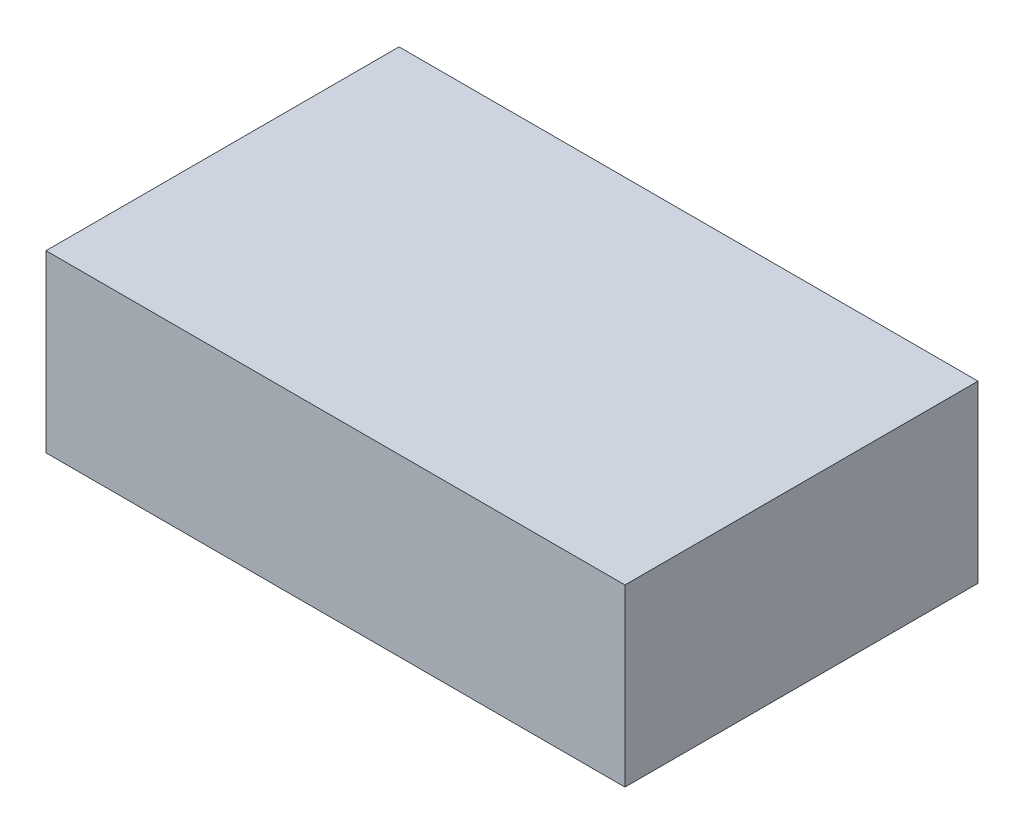
ISO-10303-21;
HEADER;
FILE_DESCRIPTION(('STEP AP214'),'2;1');
FILE_NAME('part.step','',(''),(''),'','','');
FILE_SCHEMA(('AUTOMOTIVE_DESIGN { 1 0 10303 214 1 1 1 1 }'));
ENDSEC;
DATA;
#1=APPLICATION_CONTEXT('core data for automotive mechanical design processes');
#2=APPLICATION_PROTOCOL_DEFINITION('international standard','automotive_design',2000,#1);
#3=PRODUCT_CONTEXT('',#1,'mechanical');
#4=PRODUCT('Part','Part','',(#3));
#5=PRODUCT_RELATED_PRODUCT_CATEGORY('part','',(#4));
#6=PRODUCT_DEFINITION_FORMATION('','',#4);
#7=PRODUCT_DEFINITION_CONTEXT('part definition',#1,'design');
#8=PRODUCT_DEFINITION('design','',#6,#7);
#9=PRODUCT_DEFINITION_SHAPE('','',#8);
#10=(LENGTH_UNIT() NAMED_UNIT(*) SI_UNIT(.MILLI.,.METRE.));
#11=(NAMED_UNIT(*) PLANE_ANGLE_UNIT() SI_UNIT($,.RADIAN.));
#12=(NAMED_UNIT(*) SI_UNIT($,.STERADIAN.) SOLID_ANGLE_UNIT());
#13=UNCERTAINTY_MEASURE_WITH_UNIT(LENGTH_MEASURE(1.E-05),#10,'distance_accuracy_value','');
#14=(GEOMETRIC_REPRESENTATION_CONTEXT(3) GLOBAL_UNCERTAINTY_ASSIGNED_CONTEXT((#13)) GLOBAL_UNIT_ASSIGNED_CONTEXT((#10,
#11,#12)) REPRESENTATION_CONTEXT('',''));
#15=CARTESIAN_POINT('',(0.,0.,0.));
#16=DIRECTION('',(0.,0.,1.));
#17=DIRECTION('',(1.,0.,0.));
#18=AXIS2_PLACEMENT_3D('',#15,#16,#17);
#19=CARTESIAN_POINT('',(51.25,31.,-31.25));
#20=DIRECTION('',(-1.,0.,0.));
#21=DIRECTION('',(0.,0.,1.));
#22=AXIS2_PLACEMENT_3D('',#19,#20,#21);
#23=PLANE('',#22);
#24=DIRECTION('',(0.,0.,-1.));
#25=VECTOR('',#24,1.);
#26=CARTESIAN_POINT('',(51.25,0.,-31.25));
#27=LINE('',#26,#25);
#28=CARTESIAN_POINT('',(51.25,0.,31.25));
#29=VERTEX_POINT('',#28);
#30=CARTESIAN_POINT('',(51.25,0.,-31.25));
#31=VERTEX_POINT('',#30);
#32=EDGE_CURVE('E110',#29,#31,#27,.T.);
#33=ORIENTED_EDGE('',*,*,#32,.T.);
#34=DIRECTION('',(0.,-1.,0.));
#35=VECTOR('',#34,1.);
#36=CARTESIAN_POINT('',(51.25,31.,-31.25));
#37=LINE('',#36,#35);
#38=CARTESIAN_POINT('',(51.25,31.,-31.25));
#39=VERTEX_POINT('',#38);
#40=EDGE_CURVE('E11',#39,#31,#37,.T.);
#41=ORIENTED_EDGE('',*,*,#40,.F.);
#42=DIRECTION('',(0.,0.,-1.));
#43=VECTOR('',#42,1.);
#44=CARTESIAN_POINT('',(51.25,31.,-31.25));
#45=LINE('',#44,#43);
#46=CARTESIAN_POINT('',(51.25,31.,31.25));
#47=VERTEX_POINT('',#46);
#48=EDGE_CURVE('E94',#47,#39,#45,.T.);
#49=ORIENTED_EDGE('',*,*,#48,.F.);
#50=DIRECTION('',(0.,-1.,0.));
#51=VECTOR('',#50,1.);
#52=CARTESIAN_POINT('',(51.25,31.,31.25));
#53=LINE('',#52,#51);
#54=EDGE_CURVE('E106',#47,#29,#53,.T.);
#55=ORIENTED_EDGE('',*,*,#54,.T.);
#56=EDGE_LOOP('',(#33,#41,#49,#55));
#57=FACE_BOUND('',#56,.T.);
#58=ADVANCED_FACE('F42',(#57),#23,.F.);
#59=CARTESIAN_POINT('',(-51.25,31.,-31.25));
#60=DIRECTION('',(0.,0.,1.));
#61=DIRECTION('',(1.,0.,0.));
#62=AXIS2_PLACEMENT_3D('',#59,#60,#61);
#63=PLANE('',#62);
#64=DIRECTION('',(-1.,0.,0.));
#65=VECTOR('',#64,1.);
#66=CARTESIAN_POINT('',(-51.25,0.,-31.25));
#67=LINE('',#66,#65);
#68=CARTESIAN_POINT('',(-51.25,0.,-31.25));
#69=VERTEX_POINT('',#68);
#70=EDGE_CURVE('E99',#31,#69,#67,.T.);
#71=ORIENTED_EDGE('',*,*,#70,.T.);
#72=DIRECTION('',(0.,-1.,0.));
#73=VECTOR('',#72,1.);
#74=CARTESIAN_POINT('',(-51.25,31.,-31.25));
#75=LINE('',#74,#73);
#76=CARTESIAN_POINT('',(-51.25,31.,-31.25));
#77=VERTEX_POINT('',#76);
#78=EDGE_CURVE('E51',#77,#69,#75,.T.);
#79=ORIENTED_EDGE('',*,*,#78,.F.);
#80=DIRECTION('',(-1.,0.,0.));
#81=VECTOR('',#80,1.);
#82=CARTESIAN_POINT('',(-51.25,31.,-31.25));
#83=LINE('',#82,#81);
#84=EDGE_CURVE('E89',#39,#77,#83,.T.);
#85=ORIENTED_EDGE('',*,*,#84,.F.);
#86=ORIENTED_EDGE('',*,*,#40,.T.);
#87=EDGE_LOOP('',(#71,#79,#85,#86));
#88=FACE_BOUND('',#87,.T.);
#89=ADVANCED_FACE('F98',(#88),#63,.F.);
#90=CARTESIAN_POINT('',(-51.25,31.,-31.25));
#91=DIRECTION('',(1.,0.,0.));
#92=DIRECTION('',(0.,0.,-1.));
#93=AXIS2_PLACEMENT_3D('',#90,#91,#92);
#94=PLANE('',#93);
#95=DIRECTION('',(0.,0.,1.));
#96=VECTOR('',#95,1.);
#97=CARTESIAN_POINT('',(-51.25,0.,-31.25));
#98=LINE('',#97,#96);
#99=CARTESIAN_POINT('',(-51.25,0.,31.25));
#100=VERTEX_POINT('',#99);
#101=EDGE_CURVE('E76',#69,#100,#98,.T.);
#102=ORIENTED_EDGE('',*,*,#101,.T.);
#103=DIRECTION('',(0.,-1.,0.));
#104=VECTOR('',#103,1.);
#105=CARTESIAN_POINT('',(-51.25,31.,31.25));
#106=LINE('',#105,#104);
#107=CARTESIAN_POINT('',(-51.25,31.,31.25));
#108=VERTEX_POINT('',#107);
#109=EDGE_CURVE('E101',#108,#100,#106,.T.);
#110=ORIENTED_EDGE('',*,*,#109,.F.);
#111=DIRECTION('',(0.,0.,1.));
#112=VECTOR('',#111,1.);
#113=CARTESIAN_POINT('',(-51.25,31.,-31.25));
#114=LINE('',#113,#112);
#115=EDGE_CURVE('E92',#77,#108,#114,.T.);
#116=ORIENTED_EDGE('',*,*,#115,.F.);
#117=ORIENTED_EDGE('',*,*,#78,.T.);
#118=EDGE_LOOP('',(#102,#110,#116,#117));
#119=FACE_BOUND('',#118,.T.);
#120=ADVANCED_FACE('F102',(#119),#94,.F.);
#121=CARTESIAN_POINT('',(-51.25,31.,31.25));
#122=DIRECTION('',(0.,0.,-1.));
#123=DIRECTION('',(-1.,0.,0.));
#124=AXIS2_PLACEMENT_3D('',#121,#122,#123);
#125=PLANE('',#124);
#126=DIRECTION('',(1.,0.,0.));
#127=VECTOR('',#126,1.);
#128=CARTESIAN_POINT('',(-51.25,0.,31.25));
#129=LINE('',#128,#127);
#130=EDGE_CURVE('E82',#100,#29,#129,.T.);
#131=ORIENTED_EDGE('',*,*,#130,.T.);
#132=ORIENTED_EDGE('',*,*,#54,.F.);
#133=DIRECTION('',(1.,0.,0.));
#134=VECTOR('',#133,1.);
#135=CARTESIAN_POINT('',(-51.25,31.,31.25));
#136=LINE('',#135,#134);
#137=EDGE_CURVE('E59',#108,#47,#136,.T.);
#138=ORIENTED_EDGE('',*,*,#137,.F.);
#139=ORIENTED_EDGE('',*,*,#109,.T.);
#140=EDGE_LOOP('',(#131,#132,#138,#139));
#141=FACE_BOUND('',#140,.T.);
#142=ADVANCED_FACE('F124',(#141),#125,.F.);
#143=CARTESIAN_POINT('',(0.,31.,0.));
#144=DIRECTION('',(0.,1.,0.));
#145=DIRECTION('',(0.,0.,1.));
#146=AXIS2_PLACEMENT_3D('',#143,#144,#145);
#147=PLANE('',#146);
#148=ORIENTED_EDGE('',*,*,#48,.T.);
#149=ORIENTED_EDGE('',*,*,#84,.T.);
#150=ORIENTED_EDGE('',*,*,#115,.T.);
#151=ORIENTED_EDGE('',*,*,#137,.T.);
#152=EDGE_LOOP('',(#148,#149,#150,#151));
#153=FACE_BOUND('',#152,.T.);
#154=ADVANCED_FACE('F90',(#153),#147,.T.);
#155=CARTESIAN_POINT('',(0.,0.,0.));
#156=DIRECTION('',(0.,1.,0.));
#157=DIRECTION('',(0.,0.,1.));
#158=AXIS2_PLACEMENT_3D('',#155,#156,#157);
#159=PLANE('',#158);
#160=CARTESIAN_POINT('',(-30.,0.,-20.));
#161=DIRECTION('',(0.,-1.,0.));
#162=DIRECTION('',(0.,0.,-1.));
#163=AXIS2_PLACEMENT_3D('',#160,#161,#162);
#164=CIRCLE('',#163,1.2500000000004);
#165=CARTESIAN_POINT('',(-30.,0.,-21.2500000000004));
#166=VERTEX_POINT('',#165);
#167=EDGE_CURVE('E143',#166,#166,#164,.T.);
#168=ORIENTED_EDGE('',*,*,#167,.F.);
#169=EDGE_LOOP('',(#168));
#170=FACE_BOUND('',#169,.T.);
#171=CARTESIAN_POINT('',(30.0000000000004,0.,-20.));
#172=DIRECTION('',(0.,-1.,0.));
#173=DIRECTION('',(0.,0.,-1.));
#174=AXIS2_PLACEMENT_3D('',#171,#172,#173);
#175=CIRCLE('',#174,1.25);
#176=CARTESIAN_POINT('',(30.0000000000004,0.,-21.25));
#177=VERTEX_POINT('',#176);
#178=EDGE_CURVE('E151',#177,#177,#175,.T.);
#179=ORIENTED_EDGE('',*,*,#178,.F.);
#180=EDGE_LOOP('',(#179));
#181=FACE_BOUND('',#180,.T.);
#182=CARTESIAN_POINT('',(30.,0.,20.));
#183=DIRECTION('',(0.,-1.,0.));
#184=DIRECTION('',(0.,0.,-1.));
#185=AXIS2_PLACEMENT_3D('',#182,#183,#184);
#186=CIRCLE('',#185,1.25);
#187=CARTESIAN_POINT('',(30.,0.,18.75));
#188=VERTEX_POINT('',#187);
#189=EDGE_CURVE('E135',#188,#188,#186,.T.);
#190=ORIENTED_EDGE('',*,*,#189,.F.);
#191=EDGE_LOOP('',(#190));
#192=FACE_BOUND('',#191,.T.);
#193=CARTESIAN_POINT('',(-30.,0.,20.));
#194=DIRECTION('',(0.,-1.,0.));
#195=DIRECTION('',(0.,0.,-1.));
#196=AXIS2_PLACEMENT_3D('',#193,#194,#195);
#197=CIRCLE('',#196,1.25);
#198=CARTESIAN_POINT('',(-30.,0.,18.75));
#199=VERTEX_POINT('',#198);
#200=EDGE_CURVE('E131',#199,#199,#197,.T.);
#201=ORIENTED_EDGE('',*,*,#200,.F.);
#202=EDGE_LOOP('',(#201));
#203=FACE_BOUND('',#202,.T.);
#204=ORIENTED_EDGE('',*,*,#32,.F.);
#205=ORIENTED_EDGE('',*,*,#130,.F.);
#206=ORIENTED_EDGE('',*,*,#101,.F.);
#207=ORIENTED_EDGE('',*,*,#70,.F.);
#208=EDGE_LOOP('',(#204,#205,#206,#207));
#209=FACE_BOUND('',#208,.T.);
#210=ADVANCED_FACE('F127',(#170,#181,#192,#203,#209),#159,.F.);
#211=CARTESIAN_POINT('',(-30.,5.,20.));
#212=DIRECTION('',(0.,-1.,0.));
#213=DIRECTION('',(0.,0.,-1.));
#214=AXIS2_PLACEMENT_3D('',#211,#212,#213);
#215=CYLINDRICAL_SURFACE('',#214,1.25);
#216=CARTESIAN_POINT('',(-30.,5.,20.));
#217=DIRECTION('',(0.,-1.,0.));
#218=DIRECTION('',(0.,0.,-1.));
#219=AXIS2_PLACEMENT_3D('',#216,#217,#218);
#220=CIRCLE('',#219,1.25);
#221=CARTESIAN_POINT('',(-30.,5.,18.75));
#222=VERTEX_POINT('',#221);
#223=EDGE_CURVE('E114',#222,#222,#220,.T.);
#224=ORIENTED_EDGE('',*,*,#223,.F.);
#225=EDGE_LOOP('',(#224));
#226=FACE_BOUND('',#225,.T.);
#227=ORIENTED_EDGE('',*,*,#200,.T.);
#228=EDGE_LOOP('',(#227));
#229=FACE_BOUND('',#228,.T.);
#230=ADVANCED_FACE('F167',(#226,#229),#215,.F.);
#231=CARTESIAN_POINT('',(-30.,5.,20.));
#232=DIRECTION('',(0.,-1.,0.));
#233=DIRECTION('',(0.,0.,-1.));
#234=AXIS2_PLACEMENT_3D('',#231,#232,#233);
#235=PLANE('',#234);
#236=ORIENTED_EDGE('',*,*,#223,.T.);
#237=EDGE_LOOP('',(#236));
#238=FACE_BOUND('',#237,.T.);
#239=ADVANCED_FACE('F173',(#238),#235,.T.);
#240=CARTESIAN_POINT('',(30.,5.,20.));
#241=DIRECTION('',(0.,-1.,0.));
#242=DIRECTION('',(0.,0.,-1.));
#243=AXIS2_PLACEMENT_3D('',#240,#241,#242);
#244=CYLINDRICAL_SURFACE('',#243,1.25);
#245=CARTESIAN_POINT('',(30.,5.,20.));
#246=DIRECTION('',(0.,-1.,0.));
#247=DIRECTION('',(0.,0.,-1.));
#248=AXIS2_PLACEMENT_3D('',#245,#246,#247);
#249=CIRCLE('',#248,1.25);
#250=CARTESIAN_POINT('',(30.,5.,18.75));
#251=VERTEX_POINT('',#250);
#252=EDGE_CURVE('E155',#251,#251,#249,.T.);
#253=ORIENTED_EDGE('',*,*,#252,.F.);
#254=EDGE_LOOP('',(#253));
#255=FACE_BOUND('',#254,.T.);
#256=ORIENTED_EDGE('',*,*,#189,.T.);
#257=EDGE_LOOP('',(#256));
#258=FACE_BOUND('',#257,.T.);
#259=ADVANCED_FACE('F163',(#255,#258),#244,.F.);
#260=CARTESIAN_POINT('',(30.,5.,20.));
#261=DIRECTION('',(0.,-1.,0.));
#262=DIRECTION('',(0.,0.,-1.));
#263=AXIS2_PLACEMENT_3D('',#260,#261,#262);
#264=PLANE('',#263);
#265=ORIENTED_EDGE('',*,*,#252,.T.);
#266=EDGE_LOOP('',(#265));
#267=FACE_BOUND('',#266,.T.);
#268=ADVANCED_FACE('F224',(#267),#264,.T.);
#269=CARTESIAN_POINT('',(30.0000000000004,5.,-20.));
#270=DIRECTION('',(0.,-1.,0.));
#271=DIRECTION('',(0.,0.,-1.));
#272=AXIS2_PLACEMENT_3D('',#269,#270,#271);
#273=CYLINDRICAL_SURFACE('',#272,1.25);
#274=CARTESIAN_POINT('',(30.0000000000004,5.,-20.));
#275=DIRECTION('',(0.,-1.,0.));
#276=DIRECTION('',(0.,0.,-1.));
#277=AXIS2_PLACEMENT_3D('',#274,#275,#276);
#278=CIRCLE('',#277,1.25);
#279=CARTESIAN_POINT('',(30.0000000000004,5.,-21.25));
#280=VERTEX_POINT('',#279);
#281=EDGE_CURVE('E147',#280,#280,#278,.T.);
#282=ORIENTED_EDGE('',*,*,#281,.F.);
#283=EDGE_LOOP('',(#282));
#284=FACE_BOUND('',#283,.T.);
#285=ORIENTED_EDGE('',*,*,#178,.T.);
#286=EDGE_LOOP('',(#285));
#287=FACE_BOUND('',#286,.T.);
#288=ADVANCED_FACE('F235',(#284,#287),#273,.F.);
#289=CARTESIAN_POINT('',(30.0000000000004,5.,-20.));
#290=DIRECTION('',(0.,-1.,0.));
#291=DIRECTION('',(0.,0.,-1.));
#292=AXIS2_PLACEMENT_3D('',#289,#290,#291);
#293=PLANE('',#292);
#294=ORIENTED_EDGE('',*,*,#281,.T.);
#295=EDGE_LOOP('',(#294));
#296=FACE_BOUND('',#295,.T.);
#297=ADVANCED_FACE('F246',(#296),#293,.T.);
#298=CARTESIAN_POINT('',(-30.,5.,-20.));
#299=DIRECTION('',(0.,-1.,0.));
#300=DIRECTION('',(0.,0.,-1.));
#301=AXIS2_PLACEMENT_3D('',#298,#299,#300);
#302=CYLINDRICAL_SURFACE('',#301,1.2500000000004);
#303=CARTESIAN_POINT('',(-30.,5.,-20.));
#304=DIRECTION('',(0.,-1.,0.));
#305=DIRECTION('',(0.,0.,-1.));
#306=AXIS2_PLACEMENT_3D('',#303,#304,#305);
#307=CIRCLE('',#306,1.2500000000004);
#308=CARTESIAN_POINT('',(-30.,5.,-21.2500000000004));
#309=VERTEX_POINT('',#308);
#310=EDGE_CURVE('E139',#309,#309,#307,.T.);
#311=ORIENTED_EDGE('',*,*,#310,.F.);
#312=EDGE_LOOP('',(#311));
#313=FACE_BOUND('',#312,.T.);
#314=ORIENTED_EDGE('',*,*,#167,.T.);
#315=EDGE_LOOP('',(#314));
#316=FACE_BOUND('',#315,.T.);
#317=ADVANCED_FACE('F257',(#313,#316),#302,.F.);
#318=CARTESIAN_POINT('',(-30.,5.,-20.));
#319=DIRECTION('',(0.,-1.,0.));
#320=DIRECTION('',(0.,0.,-1.));
#321=AXIS2_PLACEMENT_3D('',#318,#319,#320);
#322=PLANE('',#321);
#323=ORIENTED_EDGE('',*,*,#310,.T.);
#324=EDGE_LOOP('',(#323));
#325=FACE_BOUND('',#324,.T.);
#326=ADVANCED_FACE('F268',(#325),#322,.T.);
#327=CLOSED_SHELL('',(#58,#89,#120,#142,#154,#210,#230,#239,#259,#268,#288,#297,#317,#326));
#328=MANIFOLD_SOLID_BREP('B2',#327);
#329=ADVANCED_BREP_SHAPE_REPRESENTATION('',(#18,#328),#14);
#330=SHAPE_DEFINITION_REPRESENTATION(#9,#329);
ENDSEC;
END-ISO-10303-21;
